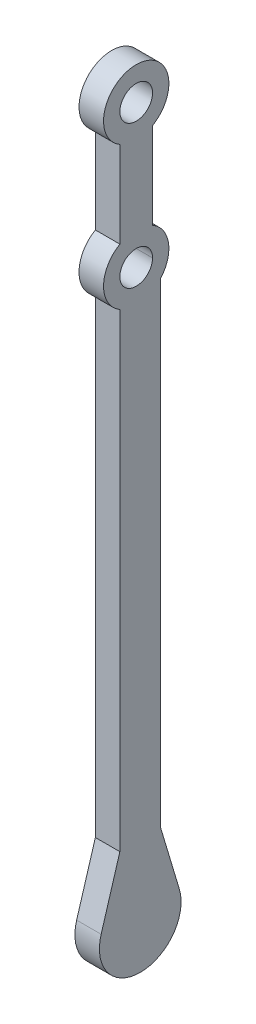
ISO-10303-21;
HEADER;
FILE_DESCRIPTION(('STEP AP214'),'2;1');
FILE_NAME('part.step','',(''),(''),'','','');
FILE_SCHEMA(('AUTOMOTIVE_DESIGN { 1 0 10303 214 1 1 1 1 }'));
ENDSEC;
DATA;
#1=APPLICATION_CONTEXT('core data for automotive mechanical design processes');
#2=APPLICATION_PROTOCOL_DEFINITION('international standard','automotive_design',2000,#1);
#3=PRODUCT_CONTEXT('',#1,'mechanical');
#4=PRODUCT('Part','Part','',(#3));
#5=PRODUCT_RELATED_PRODUCT_CATEGORY('part','',(#4));
#6=PRODUCT_DEFINITION_FORMATION('','',#4);
#7=PRODUCT_DEFINITION_CONTEXT('part definition',#1,'design');
#8=PRODUCT_DEFINITION('design','',#6,#7);
#9=PRODUCT_DEFINITION_SHAPE('','',#8);
#10=(LENGTH_UNIT() NAMED_UNIT(*) SI_UNIT(.MILLI.,.METRE.));
#11=(NAMED_UNIT(*) PLANE_ANGLE_UNIT() SI_UNIT($,.RADIAN.));
#12=(NAMED_UNIT(*) SI_UNIT($,.STERADIAN.) SOLID_ANGLE_UNIT());
#13=UNCERTAINTY_MEASURE_WITH_UNIT(LENGTH_MEASURE(1.E-05),#10,'distance_accuracy_value','');
#14=(GEOMETRIC_REPRESENTATION_CONTEXT(3) GLOBAL_UNCERTAINTY_ASSIGNED_CONTEXT((#13)) GLOBAL_UNIT_ASSIGNED_CONTEXT((#10,
#11,#12)) REPRESENTATION_CONTEXT('',''));
#15=CARTESIAN_POINT('',(0.,0.,0.));
#16=DIRECTION('',(0.,0.,1.));
#17=DIRECTION('',(1.,0.,0.));
#18=AXIS2_PLACEMENT_3D('',#15,#16,#17);
#19=CARTESIAN_POINT('',(-1.5,65.,-2.5));
#20=DIRECTION('',(0.,0.,1.));
#21=DIRECTION('',(1.,0.,0.));
#22=AXIS2_PLACEMENT_3D('',#19,#20,#21);
#23=PLANE('',#22);
#24=DIRECTION('',(0.,-1.,0.));
#25=VECTOR('',#24,1.);
#26=CARTESIAN_POINT('',(-1.5,65.,-2.5));
#27=LINE('',#26,#25);
#28=CARTESIAN_POINT('',(-1.5,62.3526368263005,-2.5));
#29=VERTEX_POINT('',#28);
#30=CARTESIAN_POINT('',(-1.5,4.05422694673163,-2.5));
#31=VERTEX_POINT('',#30);
#32=EDGE_CURVE('E45',#29,#31,#27,.T.);
#33=ORIENTED_EDGE('',*,*,#32,.F.);
#34=DIRECTION('',(-1.,0.,0.));
#35=VECTOR('',#34,1.);
#36=CARTESIAN_POINT('',(1.5,62.3526368263005,-2.5));
#37=LINE('',#36,#35);
#38=CARTESIAN_POINT('',(1.5,62.3526368263005,-2.5));
#39=VERTEX_POINT('',#38);
#40=EDGE_CURVE('E51',#29,#39,#37,.F.);
#41=ORIENTED_EDGE('',*,*,#40,.T.);
#42=DIRECTION('',(0.,-1.,0.));
#43=VECTOR('',#42,1.);
#44=CARTESIAN_POINT('',(1.5,65.,-2.5));
#45=LINE('',#44,#43);
#46=CARTESIAN_POINT('',(1.5,4.05422694673163,-2.5));
#47=VERTEX_POINT('',#46);
#48=EDGE_CURVE('E11',#39,#47,#45,.T.);
#49=ORIENTED_EDGE('',*,*,#48,.T.);
#50=DIRECTION('',(-1.,0.,0.));
#51=VECTOR('',#50,1.);
#52=CARTESIAN_POINT('',(1.5,4.05422694673163,-2.5));
#53=LINE('',#52,#51);
#54=EDGE_CURVE('E243',#47,#31,#53,.T.);
#55=ORIENTED_EDGE('',*,*,#54,.T.);
#56=EDGE_LOOP('',(#33,#41,#49,#55));
#57=FACE_BOUND('',#56,.T.);
#58=ADVANCED_FACE('F37',(#57),#23,.F.);
#59=CARTESIAN_POINT('',(-1.5,65.,2.5));
#60=DIRECTION('',(0.,0.,-1.));
#61=DIRECTION('',(-1.,0.,0.));
#62=AXIS2_PLACEMENT_3D('',#59,#60,#61);
#63=PLANE('',#62);
#64=DIRECTION('',(0.,-1.,0.));
#65=VECTOR('',#64,1.);
#66=CARTESIAN_POINT('',(1.5,65.,2.5));
#67=LINE('',#66,#65);
#68=CARTESIAN_POINT('',(1.5,61.5342865222273,2.5));
#69=VERTEX_POINT('',#68);
#70=CARTESIAN_POINT('',(1.5,4.05422694673163,2.5));
#71=VERTEX_POINT('',#70);
#72=EDGE_CURVE('E248',#69,#71,#67,.T.);
#73=ORIENTED_EDGE('',*,*,#72,.F.);
#74=DIRECTION('',(-1.,0.,0.));
#75=VECTOR('',#74,1.);
#76=CARTESIAN_POINT('',(1.5,61.5342865222273,2.5));
#77=LINE('',#76,#75);
#78=CARTESIAN_POINT('',(-1.5,61.5342865222273,2.5));
#79=VERTEX_POINT('',#78);
#80=EDGE_CURVE('E208',#69,#79,#77,.T.);
#81=ORIENTED_EDGE('',*,*,#80,.T.);
#82=DIRECTION('',(0.,-1.,0.));
#83=VECTOR('',#82,1.);
#84=CARTESIAN_POINT('',(-1.5,65.,2.5));
#85=LINE('',#84,#83);
#86=CARTESIAN_POINT('',(-1.5,4.05422694673163,2.5));
#87=VERTEX_POINT('',#86);
#88=EDGE_CURVE('E250',#79,#87,#85,.T.);
#89=ORIENTED_EDGE('',*,*,#88,.T.);
#90=DIRECTION('',(-1.,0.,0.));
#91=VECTOR('',#90,1.);
#92=CARTESIAN_POINT('',(1.5,4.05422694673163,2.5));
#93=LINE('',#92,#91);
#94=EDGE_CURVE('E230',#71,#87,#93,.T.);
#95=ORIENTED_EDGE('',*,*,#94,.F.);
#96=EDGE_LOOP('',(#73,#81,#89,#95));
#97=FACE_BOUND('',#96,.T.);
#98=ADVANCED_FACE('F284',(#97),#63,.F.);
#99=CARTESIAN_POINT('',(1.5,65.,-2.5));
#100=DIRECTION('',(-1.,0.,0.));
#101=DIRECTION('',(0.,0.,1.));
#102=AXIS2_PLACEMENT_3D('',#99,#100,#101);
#103=PLANE('',#102);
#104=CARTESIAN_POINT('',(1.5,64.9983881373651,0.500000000000001));
#105=DIRECTION('',(-1.,0.,0.));
#106=DIRECTION('',(0.,0.,1.));
#107=AXIS2_PLACEMENT_3D('',#104,#105,#106);
#108=CIRCLE('',#107,2.);
#109=CARTESIAN_POINT('',(1.5,65.,2.5));
#110=VERTEX_POINT('',#109);
#111=CARTESIAN_POINT('',(1.5,65.,-1.5));
#112=VERTEX_POINT('',#111);
#113=EDGE_CURVE('E184',#110,#112,#108,.T.);
#114=ORIENTED_EDGE('',*,*,#113,.T.);
#115=DIRECTION('',(0.,-1.,0.));
#116=VECTOR('',#115,1.);
#117=CARTESIAN_POINT('',(1.5,65.,-1.5));
#118=LINE('',#117,#116);
#119=CARTESIAN_POINT('',(1.5,64.9983881373651,-1.5));
#120=VERTEX_POINT('',#119);
#121=EDGE_CURVE('E167',#112,#120,#118,.T.);
#122=ORIENTED_EDGE('',*,*,#121,.T.);
#123=CARTESIAN_POINT('',(1.5,64.9983881373651,0.500000000000001));
#124=DIRECTION('',(-1.,0.,0.));
#125=DIRECTION('',(0.,0.,1.));
#126=AXIS2_PLACEMENT_3D('',#123,#124,#125);
#127=CIRCLE('',#126,2.);
#128=CARTESIAN_POINT('',(1.5,64.9983881373651,2.5));
#129=VERTEX_POINT('',#128);
#130=EDGE_CURVE('E142',#120,#129,#127,.T.);
#131=ORIENTED_EDGE('',*,*,#130,.T.);
#132=DIRECTION('',(0.,1.,0.));
#133=VECTOR('',#132,1.);
#134=CARTESIAN_POINT('',(1.5,65.,2.5));
#135=LINE('',#134,#133);
#136=EDGE_CURVE('E164',#129,#110,#135,.T.);
#137=ORIENTED_EDGE('',*,*,#136,.T.);
#138=EDGE_LOOP('',(#114,#122,#131,#137));
#139=FACE_BOUND('',#138,.T.);
#140=ORIENTED_EDGE('',*,*,#48,.F.);
#141=CARTESIAN_POINT('',(1.5,64.9983881373651,0.500000000000001));
#142=DIRECTION('',(-1.,0.,0.));
#143=DIRECTION('',(0.,0.,1.));
#144=AXIS2_PLACEMENT_3D('',#141,#142,#143);
#145=CIRCLE('',#144,4.00000000000001);
#146=CARTESIAN_POINT('',(1.5,68.4624897525028,-1.5));
#147=VERTEX_POINT('',#146);
#148=EDGE_CURVE('E178',#147,#39,#145,.T.);
#149=ORIENTED_EDGE('',*,*,#148,.F.);
#150=DIRECTION('',(0.,-1.,0.));
#151=VECTOR('',#150,1.);
#152=CARTESIAN_POINT('',(1.5,0.,-1.5));
#153=LINE('',#152,#151);
#154=CARTESIAN_POINT('',(1.5,79.0342865222273,-1.5));
#155=VERTEX_POINT('',#154);
#156=EDGE_CURVE('E173',#155,#147,#153,.T.);
#157=ORIENTED_EDGE('',*,*,#156,.F.);
#158=CARTESIAN_POINT('',(1.5,82.4983881373651,0.500000000000001));
#159=DIRECTION('',(-1.,0.,0.));
#160=DIRECTION('',(0.,0.,1.));
#161=AXIS2_PLACEMENT_3D('',#158,#159,#160);
#162=CIRCLE('',#161,4.);
#163=CARTESIAN_POINT('',(1.5,79.0342865222273,2.5));
#164=VERTEX_POINT('',#163);
#165=EDGE_CURVE('E170',#164,#155,#162,.T.);
#166=ORIENTED_EDGE('',*,*,#165,.F.);
#167=DIRECTION('',(0.,-1.,0.));
#168=VECTOR('',#167,1.);
#169=CARTESIAN_POINT('',(1.5,0.,2.50000000000001));
#170=LINE('',#169,#168);
#171=CARTESIAN_POINT('',(1.5,68.4624897525028,2.5));
#172=VERTEX_POINT('',#171);
#173=EDGE_CURVE('E181',#164,#172,#170,.T.);
#174=ORIENTED_EDGE('',*,*,#173,.T.);
#175=EDGE_CURVE('E177',#69,#172,#145,.T.);
#176=ORIENTED_EDGE('',*,*,#175,.F.);
#177=ORIENTED_EDGE('',*,*,#72,.T.);
#178=DIRECTION('',(0.,-0.957513610556043,0.288388081584401));
#179=VECTOR('',#178,1.);
#180=CARTESIAN_POINT('',(1.5,1.02751945515457,3.41159682472415));
#181=LINE('',#180,#179);
#182=CARTESIAN_POINT('',(1.5,-3.55805695785652,4.79270051884187));
#183=VERTEX_POINT('',#182);
#184=EDGE_CURVE('E221',#71,#183,#181,.T.);
#185=ORIENTED_EDGE('',*,*,#184,.T.);
#186=CARTESIAN_POINT('',(1.5,-4.99999736577852,0.00513246606165196));
#187=DIRECTION('',(-1.,0.,0.));
#188=DIRECTION('',(0.,0.,1.));
#189=AXIS2_PLACEMENT_3D('',#186,#187,#188);
#190=CIRCLE('',#189,5.);
#191=CARTESIAN_POINT('',(1.5,-3.56397692595271,-4.78421459762067));
#192=VERTEX_POINT('',#191);
#193=EDGE_CURVE('E227',#192,#183,#190,.T.);
#194=ORIENTED_EDGE('',*,*,#193,.F.);
#195=DIRECTION('',(0.,-0.957869412736465,-0.287204087965162));
#196=VECTOR('',#195,1.);
#197=CARTESIAN_POINT('',(1.5,1.02217775439293,-3.40911862449326));
#198=LINE('',#197,#196);
#199=EDGE_CURVE('E223',#47,#192,#198,.T.);
#200=ORIENTED_EDGE('',*,*,#199,.F.);
#201=EDGE_LOOP('',(#140,#149,#157,#166,#174,#176,#177,#185,#194,#200));
#202=FACE_BOUND('',#201,.T.);
#203=CARTESIAN_POINT('',(1.5,82.4983881373651,0.500000000000001));
#204=DIRECTION('',(-1.,0.,0.));
#205=DIRECTION('',(0.,0.,1.));
#206=AXIS2_PLACEMENT_3D('',#203,#204,#205);
#207=CIRCLE('',#206,2.);
#208=CARTESIAN_POINT('',(1.5,82.4983881373651,2.5));
#209=VERTEX_POINT('',#208);
#210=EDGE_CURVE('E187',#209,#209,#207,.T.);
#211=ORIENTED_EDGE('',*,*,#210,.T.);
#212=EDGE_LOOP('',(#211));
#213=FACE_BOUND('',#212,.T.);
#214=ADVANCED_FACE('F39',(#139,#202,#213),#103,.F.);
#215=CARTESIAN_POINT('',(-1.5,65.,-2.5));
#216=DIRECTION('',(1.,0.,0.));
#217=DIRECTION('',(0.,0.,-1.));
#218=AXIS2_PLACEMENT_3D('',#215,#216,#217);
#219=PLANE('',#218);
#220=CARTESIAN_POINT('',(-1.5,64.9983881373651,0.500000000000001));
#221=DIRECTION('',(-1.,0.,0.));
#222=DIRECTION('',(0.,0.,1.));
#223=AXIS2_PLACEMENT_3D('',#220,#221,#222);
#224=CIRCLE('',#223,4.00000000000001);
#225=CARTESIAN_POINT('',(-1.5,68.4624897525028,-1.5));
#226=VERTEX_POINT('',#225);
#227=EDGE_CURVE('E197',#226,#29,#224,.T.);
#228=ORIENTED_EDGE('',*,*,#227,.T.);
#229=ORIENTED_EDGE('',*,*,#32,.T.);
#230=DIRECTION('',(0.,-0.957869412736465,-0.287204087965162));
#231=VECTOR('',#230,1.);
#232=CARTESIAN_POINT('',(-1.5,1.02217775439293,-3.40911862449326));
#233=LINE('',#232,#231);
#234=CARTESIAN_POINT('',(-1.5,-3.56397692595271,-4.78421459762067));
#235=VERTEX_POINT('',#234);
#236=EDGE_CURVE('E233',#31,#235,#233,.T.);
#237=ORIENTED_EDGE('',*,*,#236,.T.);
#238=CARTESIAN_POINT('',(-1.5,-4.99999736577852,0.00513246606165222));
#239=DIRECTION('',(-1.,0.,0.));
#240=DIRECTION('',(0.,0.,1.));
#241=AXIS2_PLACEMENT_3D('',#238,#239,#240);
#242=CIRCLE('',#241,5.);
#243=CARTESIAN_POINT('',(-1.5,-3.55805695785652,4.79270051884187));
#244=VERTEX_POINT('',#243);
#245=EDGE_CURVE('E224',#235,#244,#242,.T.);
#246=ORIENTED_EDGE('',*,*,#245,.T.);
#247=DIRECTION('',(0.,-0.957513610556043,0.288388081584401));
#248=VECTOR('',#247,1.);
#249=CARTESIAN_POINT('',(-1.5,1.02751945515457,3.41159682472415));
#250=LINE('',#249,#248);
#251=EDGE_CURVE('E220',#87,#244,#250,.T.);
#252=ORIENTED_EDGE('',*,*,#251,.F.);
#253=ORIENTED_EDGE('',*,*,#88,.F.);
#254=CARTESIAN_POINT('',(-1.5,68.4624897525028,2.5));
#255=VERTEX_POINT('',#254);
#256=EDGE_CURVE('E196',#79,#255,#224,.T.);
#257=ORIENTED_EDGE('',*,*,#256,.T.);
#258=DIRECTION('',(0.,-1.,0.));
#259=VECTOR('',#258,1.);
#260=CARTESIAN_POINT('',(-1.5,0.,2.50000000000001));
#261=LINE('',#260,#259);
#262=CARTESIAN_POINT('',(-1.5,79.0342865222273,2.5));
#263=VERTEX_POINT('',#262);
#264=EDGE_CURVE('E200',#263,#255,#261,.T.);
#265=ORIENTED_EDGE('',*,*,#264,.F.);
#266=CARTESIAN_POINT('',(-1.5,82.4983881373651,0.500000000000001));
#267=DIRECTION('',(-1.,0.,0.));
#268=DIRECTION('',(0.,0.,1.));
#269=AXIS2_PLACEMENT_3D('',#266,#267,#268);
#270=CIRCLE('',#269,4.);
#271=CARTESIAN_POINT('',(-1.5,79.0342865222273,-1.5));
#272=VERTEX_POINT('',#271);
#273=EDGE_CURVE('E169',#263,#272,#270,.T.);
#274=ORIENTED_EDGE('',*,*,#273,.T.);
#275=DIRECTION('',(0.,-1.,0.));
#276=VECTOR('',#275,1.);
#277=CARTESIAN_POINT('',(-1.5,0.,-1.5));
#278=LINE('',#277,#276);
#279=EDGE_CURVE('E193',#272,#226,#278,.T.);
#280=ORIENTED_EDGE('',*,*,#279,.T.);
#281=EDGE_LOOP('',(#228,#229,#237,#246,#252,#253,#257,#265,#274,#280));
#282=FACE_BOUND('',#281,.T.);
#283=CARTESIAN_POINT('',(-1.5,64.9983881373651,0.500000000000001));
#284=DIRECTION('',(-1.,0.,0.));
#285=DIRECTION('',(0.,0.,1.));
#286=AXIS2_PLACEMENT_3D('',#283,#284,#285);
#287=CIRCLE('',#286,2.);
#288=CARTESIAN_POINT('',(-1.5,64.9983881373651,-1.5));
#289=VERTEX_POINT('',#288);
#290=CARTESIAN_POINT('',(-1.5,64.9983881373651,2.5));
#291=VERTEX_POINT('',#290);
#292=EDGE_CURVE('E139',#289,#291,#287,.T.);
#293=ORIENTED_EDGE('',*,*,#292,.F.);
#294=DIRECTION('',(0.,-1.,0.));
#295=VECTOR('',#294,1.);
#296=CARTESIAN_POINT('',(-1.5,0.,-1.5));
#297=LINE('',#296,#295);
#298=CARTESIAN_POINT('',(-1.5,65.,-1.5));
#299=VERTEX_POINT('',#298);
#300=EDGE_CURVE('E149',#299,#289,#297,.T.);
#301=ORIENTED_EDGE('',*,*,#300,.F.);
#302=CARTESIAN_POINT('',(-1.5,64.9983881373651,0.500000000000001));
#303=DIRECTION('',(-1.,0.,0.));
#304=DIRECTION('',(0.,0.,1.));
#305=AXIS2_PLACEMENT_3D('',#302,#303,#304);
#306=CIRCLE('',#305,2.);
#307=CARTESIAN_POINT('',(-1.5,65.,2.5));
#308=VERTEX_POINT('',#307);
#309=EDGE_CURVE('E203',#308,#299,#306,.T.);
#310=ORIENTED_EDGE('',*,*,#309,.F.);
#311=DIRECTION('',(0.,1.,0.));
#312=VECTOR('',#311,1.);
#313=CARTESIAN_POINT('',(-1.5,0.,2.5));
#314=LINE('',#313,#312);
#315=EDGE_CURVE('E146',#291,#308,#314,.T.);
#316=ORIENTED_EDGE('',*,*,#315,.F.);
#317=EDGE_LOOP('',(#293,#301,#310,#316));
#318=FACE_BOUND('',#317,.T.);
#319=CARTESIAN_POINT('',(-1.5,82.4983881373651,0.500000000000001));
#320=DIRECTION('',(-1.,0.,0.));
#321=DIRECTION('',(0.,0.,1.));
#322=AXIS2_PLACEMENT_3D('',#319,#320,#321);
#323=CIRCLE('',#322,2.);
#324=CARTESIAN_POINT('',(-1.5,82.4983881373651,2.5));
#325=VERTEX_POINT('',#324);
#326=EDGE_CURVE('E174',#325,#325,#323,.T.);
#327=ORIENTED_EDGE('',*,*,#326,.F.);
#328=EDGE_LOOP('',(#327));
#329=FACE_BOUND('',#328,.T.);
#330=ADVANCED_FACE('F157',(#282,#318,#329),#219,.F.);
#331=CARTESIAN_POINT('',(1.5,1.02751945515457,3.41159682472415));
#332=DIRECTION('',(0.,-0.288388081584401,-0.957513610556043));
#333=DIRECTION('',(0.,0.957513610556043,-0.288388081584401));
#334=AXIS2_PLACEMENT_3D('',#331,#332,#333);
#335=PLANE('',#334);
#336=ORIENTED_EDGE('',*,*,#251,.T.);
#337=DIRECTION('',(-1.,0.,0.));
#338=VECTOR('',#337,1.);
#339=CARTESIAN_POINT('',(1.5,-3.55805695785652,4.79270051884187));
#340=LINE('',#339,#338);
#341=EDGE_CURVE('E238',#183,#244,#340,.T.);
#342=ORIENTED_EDGE('',*,*,#341,.F.);
#343=ORIENTED_EDGE('',*,*,#184,.F.);
#344=ORIENTED_EDGE('',*,*,#94,.T.);
#345=EDGE_LOOP('',(#336,#342,#343,#344));
#346=FACE_BOUND('',#345,.T.);
#347=ADVANCED_FACE('F288',(#346),#335,.F.);
#348=CARTESIAN_POINT('',(1.5,-4.99999736577852,0.00513246606165196));
#349=DIRECTION('',(-1.,0.,0.));
#350=DIRECTION('',(0.,0.,1.));
#351=AXIS2_PLACEMENT_3D('',#348,#349,#350);
#352=CYLINDRICAL_SURFACE('',#351,5.);
#353=ORIENTED_EDGE('',*,*,#245,.F.);
#354=DIRECTION('',(-1.,0.,0.));
#355=VECTOR('',#354,1.);
#356=CARTESIAN_POINT('',(1.5,-3.56397692595271,-4.78421459762067));
#357=LINE('',#356,#355);
#358=EDGE_CURVE('E241',#192,#235,#357,.T.);
#359=ORIENTED_EDGE('',*,*,#358,.F.);
#360=ORIENTED_EDGE('',*,*,#193,.T.);
#361=ORIENTED_EDGE('',*,*,#341,.T.);
#362=EDGE_LOOP('',(#353,#359,#360,#361));
#363=FACE_BOUND('',#362,.T.);
#364=ADVANCED_FACE('F291',(#363),#352,.T.);
#365=CARTESIAN_POINT('',(1.5,1.02217775439293,-3.40911862449326));
#366=DIRECTION('',(0.,0.287204087965162,-0.957869412736464));
#367=DIRECTION('',(0.,0.957869412736465,0.287204087965162));
#368=AXIS2_PLACEMENT_3D('',#365,#366,#367);
#369=PLANE('',#368);
#370=ORIENTED_EDGE('',*,*,#236,.F.);
#371=ORIENTED_EDGE('',*,*,#54,.F.);
#372=ORIENTED_EDGE('',*,*,#199,.T.);
#373=ORIENTED_EDGE('',*,*,#358,.T.);
#374=EDGE_LOOP('',(#370,#371,#372,#373));
#375=FACE_BOUND('',#374,.T.);
#376=ADVANCED_FACE('F257',(#375),#369,.T.);
#377=CARTESIAN_POINT('',(1.5,64.9983881373651,0.500000000000001));
#378=DIRECTION('',(-1.,0.,0.));
#379=DIRECTION('',(0.,0.,1.));
#380=AXIS2_PLACEMENT_3D('',#377,#378,#379);
#381=CYLINDRICAL_SURFACE('',#380,4.00000000000001);
#382=ORIENTED_EDGE('',*,*,#40,.F.);
#383=ORIENTED_EDGE('',*,*,#227,.F.);
#384=DIRECTION('',(-1.,0.,0.));
#385=VECTOR('',#384,1.);
#386=CARTESIAN_POINT('',(1.5,68.4624897525028,-1.5));
#387=LINE('',#386,#385);
#388=EDGE_CURVE('E214',#147,#226,#387,.T.);
#389=ORIENTED_EDGE('',*,*,#388,.F.);
#390=ORIENTED_EDGE('',*,*,#148,.T.);
#391=EDGE_LOOP('',(#382,#383,#389,#390));
#392=FACE_BOUND('',#391,.T.);
#393=ADVANCED_FACE('F265',(#392),#381,.T.);
#394=ORIENTED_EDGE('',*,*,#80,.F.);
#395=ORIENTED_EDGE('',*,*,#175,.T.);
#396=DIRECTION('',(-1.,0.,0.));
#397=VECTOR('',#396,1.);
#398=CARTESIAN_POINT('',(1.5,68.4624897525028,2.5));
#399=LINE('',#398,#397);
#400=EDGE_CURVE('E211',#172,#255,#399,.T.);
#401=ORIENTED_EDGE('',*,*,#400,.T.);
#402=ORIENTED_EDGE('',*,*,#256,.F.);
#403=EDGE_LOOP('',(#394,#395,#401,#402));
#404=FACE_BOUND('',#403,.T.);
#405=ADVANCED_FACE('F339',(#404),#381,.T.);
#406=CARTESIAN_POINT('',(1.5,82.4983881373651,0.500000000000001));
#407=DIRECTION('',(-1.,0.,0.));
#408=DIRECTION('',(0.,0.,1.));
#409=AXIS2_PLACEMENT_3D('',#406,#407,#408);
#410=CYLINDRICAL_SURFACE('',#409,4.);
#411=ORIENTED_EDGE('',*,*,#273,.F.);
#412=DIRECTION('',(-1.,0.,0.));
#413=VECTOR('',#412,1.);
#414=CARTESIAN_POINT('',(1.5,79.0342865222273,2.5));
#415=LINE('',#414,#413);
#416=EDGE_CURVE('E209',#164,#263,#415,.T.);
#417=ORIENTED_EDGE('',*,*,#416,.F.);
#418=ORIENTED_EDGE('',*,*,#165,.T.);
#419=DIRECTION('',(-1.,0.,0.));
#420=VECTOR('',#419,1.);
#421=CARTESIAN_POINT('',(1.5,79.0342865222273,-1.5));
#422=LINE('',#421,#420);
#423=EDGE_CURVE('E190',#155,#272,#422,.T.);
#424=ORIENTED_EDGE('',*,*,#423,.T.);
#425=EDGE_LOOP('',(#411,#417,#418,#424));
#426=FACE_BOUND('',#425,.T.);
#427=ADVANCED_FACE('F272',(#426),#410,.T.);
#428=CARTESIAN_POINT('',(1.5,0.,2.50000000000001));
#429=DIRECTION('',(0.,0.,-1.));
#430=DIRECTION('',(0.,1.,0.));
#431=AXIS2_PLACEMENT_3D('',#428,#429,#430);
#432=PLANE('',#431);
#433=ORIENTED_EDGE('',*,*,#264,.T.);
#434=ORIENTED_EDGE('',*,*,#400,.F.);
#435=ORIENTED_EDGE('',*,*,#173,.F.);
#436=ORIENTED_EDGE('',*,*,#416,.T.);
#437=EDGE_LOOP('',(#433,#434,#435,#436));
#438=FACE_BOUND('',#437,.T.);
#439=ADVANCED_FACE('F277',(#438),#432,.F.);
#440=CARTESIAN_POINT('',(1.5,64.9983881373651,0.500000000000001));
#441=DIRECTION('',(-1.,0.,0.));
#442=DIRECTION('',(0.,0.,1.));
#443=AXIS2_PLACEMENT_3D('',#440,#441,#442);
#444=CYLINDRICAL_SURFACE('',#443,2.);
#445=ORIENTED_EDGE('',*,*,#309,.T.);
#446=DIRECTION('',(-1.,0.,0.));
#447=VECTOR('',#446,1.);
#448=CARTESIAN_POINT('',(1.5,65.,-1.5));
#449=LINE('',#448,#447);
#450=EDGE_CURVE('E152',#112,#299,#449,.T.);
#451=ORIENTED_EDGE('',*,*,#450,.F.);
#452=ORIENTED_EDGE('',*,*,#113,.F.);
#453=DIRECTION('',(1.,0.,0.));
#454=VECTOR('',#453,1.);
#455=CARTESIAN_POINT('',(-1.5,65.,2.5));
#456=LINE('',#455,#454);
#457=EDGE_CURVE('E240',#308,#110,#456,.T.);
#458=ORIENTED_EDGE('',*,*,#457,.F.);
#459=EDGE_LOOP('',(#445,#451,#452,#458));
#460=FACE_BOUND('',#459,.T.);
#461=ADVANCED_FACE('F317',(#460),#444,.F.);
#462=CARTESIAN_POINT('',(1.5,0.,-1.5));
#463=DIRECTION('',(0.,0.,-1.));
#464=DIRECTION('',(-1.,0.,0.));
#465=AXIS2_PLACEMENT_3D('',#462,#463,#464);
#466=PLANE('',#465);
#467=ORIENTED_EDGE('',*,*,#279,.F.);
#468=ORIENTED_EDGE('',*,*,#423,.F.);
#469=ORIENTED_EDGE('',*,*,#156,.T.);
#470=ORIENTED_EDGE('',*,*,#388,.T.);
#471=EDGE_LOOP('',(#467,#468,#469,#470));
#472=FACE_BOUND('',#471,.T.);
#473=ADVANCED_FACE('F268',(#472),#466,.T.);
#474=CARTESIAN_POINT('',(1.5,82.4983881373651,0.500000000000001));
#475=DIRECTION('',(-1.,0.,0.));
#476=DIRECTION('',(0.,0.,1.));
#477=AXIS2_PLACEMENT_3D('',#474,#475,#476);
#478=CYLINDRICAL_SURFACE('',#477,2.);
#479=ORIENTED_EDGE('',*,*,#210,.F.);
#480=EDGE_LOOP('',(#479));
#481=FACE_BOUND('',#480,.T.);
#482=ORIENTED_EDGE('',*,*,#326,.T.);
#483=EDGE_LOOP('',(#482));
#484=FACE_BOUND('',#483,.T.);
#485=ADVANCED_FACE('F327',(#481,#484),#478,.F.);
#486=CARTESIAN_POINT('',(8.5,0.,-1.5));
#487=DIRECTION('',(0.,0.,-1.));
#488=DIRECTION('',(-1.,0.,0.));
#489=AXIS2_PLACEMENT_3D('',#486,#487,#488);
#490=PLANE('',#489);
#491=ORIENTED_EDGE('',*,*,#450,.T.);
#492=ORIENTED_EDGE('',*,*,#300,.T.);
#493=DIRECTION('',(-1.,0.,0.));
#494=VECTOR('',#493,1.);
#495=CARTESIAN_POINT('',(8.5,64.9983881373651,-1.5));
#496=LINE('',#495,#494);
#497=EDGE_CURVE('E134',#120,#289,#496,.T.);
#498=ORIENTED_EDGE('',*,*,#497,.F.);
#499=ORIENTED_EDGE('',*,*,#121,.F.);
#500=EDGE_LOOP('',(#491,#492,#498,#499));
#501=FACE_BOUND('',#500,.T.);
#502=ADVANCED_FACE('F150',(#501),#490,.F.);
#503=CARTESIAN_POINT('',(8.5,0.,2.5));
#504=DIRECTION('',(0.,0.,1.));
#505=DIRECTION('',(1.,0.,0.));
#506=AXIS2_PLACEMENT_3D('',#503,#504,#505);
#507=PLANE('',#506);
#508=DIRECTION('',(-1.,0.,0.));
#509=VECTOR('',#508,1.);
#510=CARTESIAN_POINT('',(8.5,64.9983881373651,2.5));
#511=LINE('',#510,#509);
#512=EDGE_CURVE('E145',#129,#291,#511,.T.);
#513=ORIENTED_EDGE('',*,*,#512,.T.);
#514=ORIENTED_EDGE('',*,*,#315,.T.);
#515=ORIENTED_EDGE('',*,*,#457,.T.);
#516=ORIENTED_EDGE('',*,*,#136,.F.);
#517=EDGE_LOOP('',(#513,#514,#515,#516));
#518=FACE_BOUND('',#517,.T.);
#519=ADVANCED_FACE('F319',(#518),#507,.F.);
#520=CARTESIAN_POINT('',(8.5,64.9983881373651,0.5));
#521=DIRECTION('',(-1.,0.,0.));
#522=DIRECTION('',(0.,0.,1.));
#523=AXIS2_PLACEMENT_3D('',#520,#521,#522);
#524=CYLINDRICAL_SURFACE('',#523,2.);
#525=ORIENTED_EDGE('',*,*,#497,.T.);
#526=ORIENTED_EDGE('',*,*,#292,.T.);
#527=ORIENTED_EDGE('',*,*,#512,.F.);
#528=ORIENTED_EDGE('',*,*,#130,.F.);
#529=EDGE_LOOP('',(#525,#526,#527,#528));
#530=FACE_BOUND('',#529,.T.);
#531=ADVANCED_FACE('F136',(#530),#524,.F.);
#532=CLOSED_SHELL('',(#58,#98,#214,#330,#347,#364,#376,#393,#405,#427,#439,#461,#473,#485,#502,
#519,#531));
#533=MANIFOLD_SOLID_BREP('B2',#532);
#534=ADVANCED_BREP_SHAPE_REPRESENTATION('',(#18,#533),#14);
#535=SHAPE_DEFINITION_REPRESENTATION(#9,#534);
ENDSEC;
END-ISO-10303-21;
